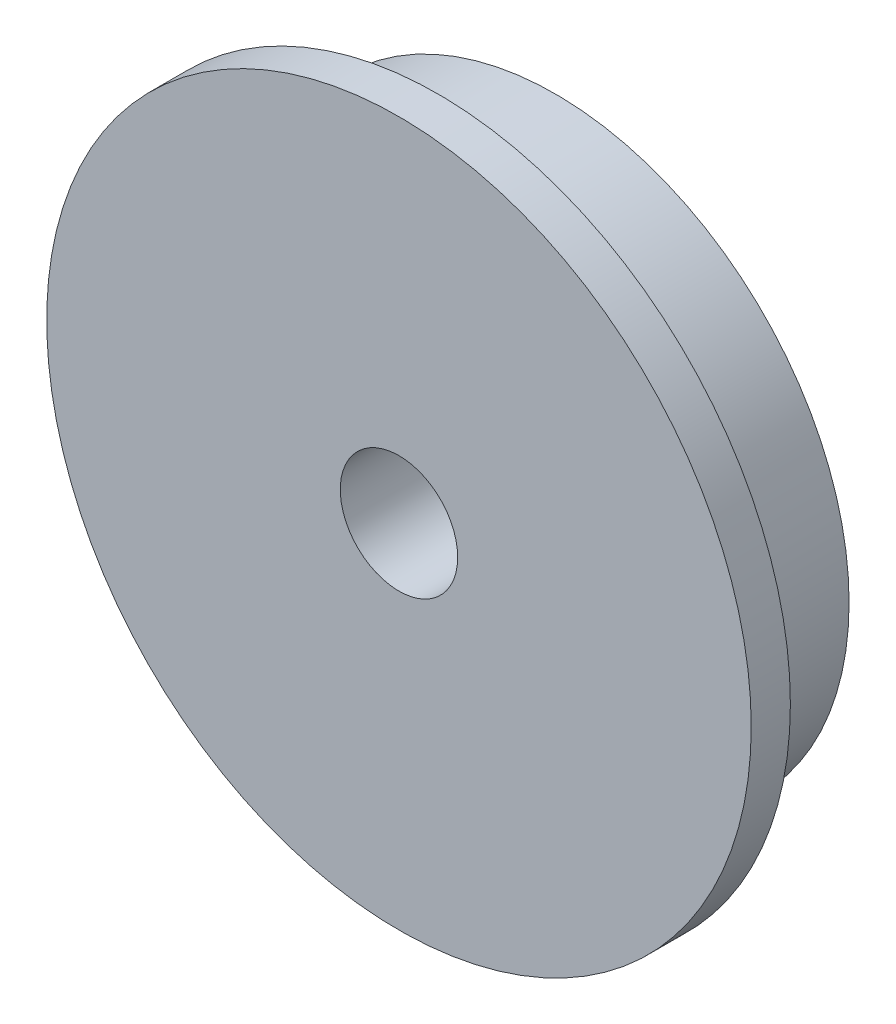
ISO-10303-21;
HEADER;
FILE_DESCRIPTION(('STEP AP214'),'2;1');
FILE_NAME('part.step','',(''),(''),'','','');
FILE_SCHEMA(('AUTOMOTIVE_DESIGN { 1 0 10303 214 1 1 1 1 }'));
ENDSEC;
DATA;
#1=APPLICATION_CONTEXT('core data for automotive mechanical design processes');
#2=APPLICATION_PROTOCOL_DEFINITION('international standard','automotive_design',2000,#1);
#3=PRODUCT_CONTEXT('',#1,'mechanical');
#4=PRODUCT('Part','Part','',(#3));
#5=PRODUCT_RELATED_PRODUCT_CATEGORY('part','',(#4));
#6=PRODUCT_DEFINITION_FORMATION('','',#4);
#7=PRODUCT_DEFINITION_CONTEXT('part definition',#1,'design');
#8=PRODUCT_DEFINITION('design','',#6,#7);
#9=PRODUCT_DEFINITION_SHAPE('','',#8);
#10=(LENGTH_UNIT() NAMED_UNIT(*) SI_UNIT(.MILLI.,.METRE.));
#11=(NAMED_UNIT(*) PLANE_ANGLE_UNIT() SI_UNIT($,.RADIAN.));
#12=(NAMED_UNIT(*) SI_UNIT($,.STERADIAN.) SOLID_ANGLE_UNIT());
#13=UNCERTAINTY_MEASURE_WITH_UNIT(LENGTH_MEASURE(1.E-05),#10,'distance_accuracy_value','');
#14=(GEOMETRIC_REPRESENTATION_CONTEXT(3) GLOBAL_UNCERTAINTY_ASSIGNED_CONTEXT((#13)) GLOBAL_UNIT_ASSIGNED_CONTEXT((#10,
#11,#12)) REPRESENTATION_CONTEXT('',''));
#15=CARTESIAN_POINT('',(0.,0.,0.));
#16=DIRECTION('',(0.,0.,1.));
#17=DIRECTION('',(1.,0.,0.));
#18=AXIS2_PLACEMENT_3D('',#15,#16,#17);
#19=CARTESIAN_POINT('',(0.,0.,8.));
#20=DIRECTION('',(0.,0.,-1.));
#21=DIRECTION('',(-1.,0.,0.));
#22=AXIS2_PLACEMENT_3D('',#19,#20,#21);
#23=CYLINDRICAL_SURFACE('',#22,15.);
#24=CARTESIAN_POINT('',(0.,0.,0.));
#25=DIRECTION('',(0.,0.,1.));
#26=DIRECTION('',(1.,0.,0.));
#27=AXIS2_PLACEMENT_3D('',#24,#25,#26);
#28=CIRCLE('',#27,15.);
#29=CARTESIAN_POINT('',(15.,0.,0.));
#30=VERTEX_POINT('',#29);
#31=EDGE_CURVE('E40',#30,#30,#28,.T.);
#32=ORIENTED_EDGE('',*,*,#31,.T.);
#33=EDGE_LOOP('',(#32));
#34=FACE_BOUND('',#33,.T.);
#35=CARTESIAN_POINT('',(0.,0.,6.));
#36=DIRECTION('',(0.,0.,1.));
#37=DIRECTION('',(1.,0.,0.));
#38=AXIS2_PLACEMENT_3D('',#35,#36,#37);
#39=CIRCLE('',#38,15.);
#40=CARTESIAN_POINT('',(15.,0.,6.));
#41=VERTEX_POINT('',#40);
#42=EDGE_CURVE('E10',#41,#41,#39,.T.);
#43=ORIENTED_EDGE('',*,*,#42,.F.);
#44=EDGE_LOOP('',(#43));
#45=FACE_BOUND('',#44,.T.);
#46=ADVANCED_FACE('F37',(#34,#45),#23,.T.);
#47=CARTESIAN_POINT('',(0.,0.,8.));
#48=DIRECTION('',(0.,0.,1.));
#49=DIRECTION('',(1.,0.,0.));
#50=AXIS2_PLACEMENT_3D('',#47,#48,#49);
#51=PLANE('',#50);
#52=CARTESIAN_POINT('',(0.,0.,8.));
#53=DIRECTION('',(0.,0.,1.));
#54=DIRECTION('',(1.,0.,0.));
#55=AXIS2_PLACEMENT_3D('',#52,#53,#54);
#56=CIRCLE('',#55,3.);
#57=CARTESIAN_POINT('',(3.,0.,8.));
#58=VERTEX_POINT('',#57);
#59=EDGE_CURVE('E48',#58,#58,#56,.T.);
#60=ORIENTED_EDGE('',*,*,#59,.F.);
#61=EDGE_LOOP('',(#60));
#62=FACE_BOUND('',#61,.T.);
#63=CARTESIAN_POINT('',(0.,0.,8.));
#64=DIRECTION('',(0.,0.,1.));
#65=DIRECTION('',(1.,0.,0.));
#66=AXIS2_PLACEMENT_3D('',#63,#64,#65);
#67=CIRCLE('',#66,18.);
#68=CARTESIAN_POINT('',(18.,0.,8.));
#69=VERTEX_POINT('',#68);
#70=EDGE_CURVE('E51',#69,#69,#67,.T.);
#71=ORIENTED_EDGE('',*,*,#70,.T.);
#72=EDGE_LOOP('',(#71));
#73=FACE_BOUND('',#72,.T.);
#74=ADVANCED_FACE('F65',(#62,#73),#51,.T.);
#75=CARTESIAN_POINT('',(0.,0.,0.));
#76=DIRECTION('',(0.,0.,1.));
#77=DIRECTION('',(1.,0.,0.));
#78=AXIS2_PLACEMENT_3D('',#75,#76,#77);
#79=PLANE('',#78);
#80=ORIENTED_EDGE('',*,*,#31,.F.);
#81=EDGE_LOOP('',(#80));
#82=FACE_BOUND('',#81,.T.);
#83=CARTESIAN_POINT('',(0.,0.,0.));
#84=DIRECTION('',(0.,0.,1.));
#85=DIRECTION('',(1.,0.,0.));
#86=AXIS2_PLACEMENT_3D('',#83,#84,#85);
#87=CIRCLE('',#86,3.);
#88=CARTESIAN_POINT('',(3.,0.,0.));
#89=VERTEX_POINT('',#88);
#90=EDGE_CURVE('E54',#89,#89,#87,.T.);
#91=ORIENTED_EDGE('',*,*,#90,.T.);
#92=EDGE_LOOP('',(#91));
#93=FACE_BOUND('',#92,.T.);
#94=ADVANCED_FACE('F83',(#82,#93),#79,.F.);
#95=CARTESIAN_POINT('',(0.,0.,8.));
#96=DIRECTION('',(0.,0.,-1.));
#97=DIRECTION('',(-1.,0.,0.));
#98=AXIS2_PLACEMENT_3D('',#95,#96,#97);
#99=CYLINDRICAL_SURFACE('',#98,3.);
#100=ORIENTED_EDGE('',*,*,#59,.T.);
#101=EDGE_LOOP('',(#100));
#102=FACE_BOUND('',#101,.T.);
#103=ORIENTED_EDGE('',*,*,#90,.F.);
#104=EDGE_LOOP('',(#103));
#105=FACE_BOUND('',#104,.T.);
#106=ADVANCED_FACE('F74',(#102,#105),#99,.F.);
#107=CARTESIAN_POINT('',(0.,0.,6.));
#108=DIRECTION('',(0.,0.,1.));
#109=DIRECTION('',(1.,0.,0.));
#110=AXIS2_PLACEMENT_3D('',#107,#108,#109);
#111=PLANE('',#110);
#112=CARTESIAN_POINT('',(0.,0.,6.));
#113=DIRECTION('',(0.,0.,1.));
#114=DIRECTION('',(1.,0.,0.));
#115=AXIS2_PLACEMENT_3D('',#112,#113,#114);
#116=CIRCLE('',#115,18.);
#117=CARTESIAN_POINT('',(18.,0.,6.));
#118=VERTEX_POINT('',#117);
#119=EDGE_CURVE('E56',#118,#118,#116,.T.);
#120=ORIENTED_EDGE('',*,*,#119,.F.);
#121=EDGE_LOOP('',(#120));
#122=FACE_BOUND('',#121,.T.);
#123=ORIENTED_EDGE('',*,*,#42,.T.);
#124=EDGE_LOOP('',(#123));
#125=FACE_BOUND('',#124,.T.);
#126=ADVANCED_FACE('F69',(#122,#125),#111,.F.);
#127=CARTESIAN_POINT('',(0.,0.,6.));
#128=DIRECTION('',(0.,0.,1.));
#129=DIRECTION('',(1.,0.,0.));
#130=AXIS2_PLACEMENT_3D('',#127,#128,#129);
#131=CYLINDRICAL_SURFACE('',#130,18.);
#132=ORIENTED_EDGE('',*,*,#119,.T.);
#133=EDGE_LOOP('',(#132));
#134=FACE_BOUND('',#133,.T.);
#135=ORIENTED_EDGE('',*,*,#70,.F.);
#136=EDGE_LOOP('',(#135));
#137=FACE_BOUND('',#136,.T.);
#138=ADVANCED_FACE('F67',(#134,#137),#131,.T.);
#139=CLOSED_SHELL('',(#46,#74,#94,#106,#126,#138));
#140=MANIFOLD_SOLID_BREP('B2',#139);
#141=ADVANCED_BREP_SHAPE_REPRESENTATION('',(#18,#140),#14);
#142=SHAPE_DEFINITION_REPRESENTATION(#9,#141);
ENDSEC;
END-ISO-10303-21;
